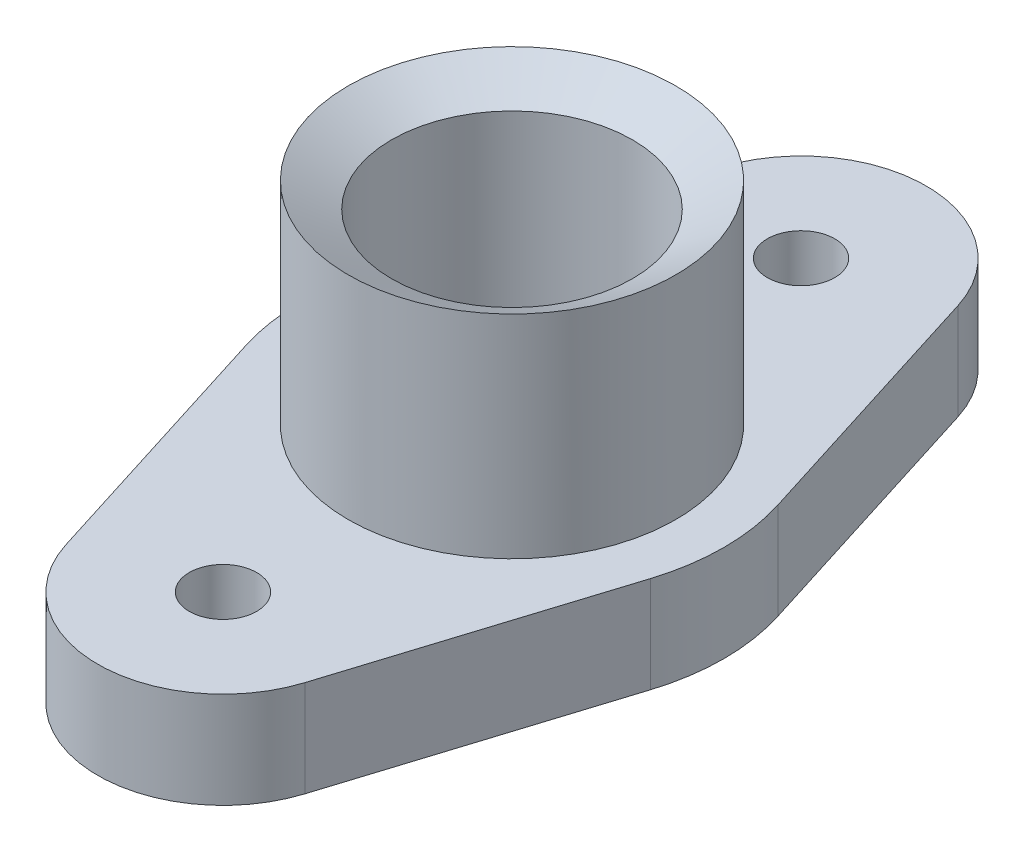
ISO-10303-21;
HEADER;
FILE_DESCRIPTION(('STEP AP214'),'2;1');
FILE_NAME('part.step','',(''),(''),'','','');
FILE_SCHEMA(('AUTOMOTIVE_DESIGN { 1 0 10303 214 1 1 1 1 }'));
ENDSEC;
DATA;
#1=APPLICATION_CONTEXT('core data for automotive mechanical design processes');
#2=APPLICATION_PROTOCOL_DEFINITION('international standard','automotive_design',2000,#1);
#3=PRODUCT_CONTEXT('',#1,'mechanical');
#4=PRODUCT('Part','Part','',(#3));
#5=PRODUCT_RELATED_PRODUCT_CATEGORY('part','',(#4));
#6=PRODUCT_DEFINITION_FORMATION('','',#4);
#7=PRODUCT_DEFINITION_CONTEXT('part definition',#1,'design');
#8=PRODUCT_DEFINITION('design','',#6,#7);
#9=PRODUCT_DEFINITION_SHAPE('','',#8);
#10=(LENGTH_UNIT() NAMED_UNIT(*) SI_UNIT(.MILLI.,.METRE.));
#11=(NAMED_UNIT(*) PLANE_ANGLE_UNIT() SI_UNIT($,.RADIAN.));
#12=(NAMED_UNIT(*) SI_UNIT($,.STERADIAN.) SOLID_ANGLE_UNIT());
#13=UNCERTAINTY_MEASURE_WITH_UNIT(LENGTH_MEASURE(1.E-05),#10,'distance_accuracy_value','');
#14=(GEOMETRIC_REPRESENTATION_CONTEXT(3) GLOBAL_UNCERTAINTY_ASSIGNED_CONTEXT((#13)) GLOBAL_UNIT_ASSIGNED_CONTEXT((#10,
#11,#12)) REPRESENTATION_CONTEXT('',''));
#15=CARTESIAN_POINT('',(0.,0.,0.));
#16=DIRECTION('',(0.,0.,1.));
#17=DIRECTION('',(1.,0.,0.));
#18=AXIS2_PLACEMENT_3D('',#15,#16,#17);
#19=CARTESIAN_POINT('',(0.,32.,0.));
#20=DIRECTION('',(0.,1.,0.));
#21=DIRECTION('',(0.,0.,1.));
#22=AXIS2_PLACEMENT_3D('',#19,#20,#21);
#23=CYLINDRICAL_SURFACE('',#22,12.5);
#24=CARTESIAN_POINT('',(0.,0.,0.));
#25=DIRECTION('',(0.,1.,0.));
#26=DIRECTION('',(0.,0.,1.));
#27=AXIS2_PLACEMENT_3D('',#24,#25,#26);
#28=CIRCLE('',#27,12.5);
#29=CARTESIAN_POINT('',(0.,0.,12.5));
#30=VERTEX_POINT('',#29);
#31=EDGE_CURVE('E232',#30,#30,#28,.T.);
#32=ORIENTED_EDGE('',*,*,#31,.F.);
#33=EDGE_LOOP('',(#32));
#34=FACE_BOUND('',#33,.T.);
#35=CARTESIAN_POINT('',(0.,29.4019237886467,0.));
#36=DIRECTION('',(0.,1.,0.));
#37=DIRECTION('',(-1.,0.,0.));
#38=AXIS2_PLACEMENT_3D('',#35,#36,#37);
#39=CIRCLE('',#38,12.5);
#40=CARTESIAN_POINT('',(-12.5,29.4019237886467,0.));
#41=VERTEX_POINT('',#40);
#42=EDGE_CURVE('E45',#41,#41,#39,.F.);
#43=ORIENTED_EDGE('',*,*,#42,.F.);
#44=EDGE_LOOP('',(#43));
#45=FACE_BOUND('',#44,.T.);
#46=ADVANCED_FACE('F41',(#34,#45),#23,.F.);
#47=CARTESIAN_POINT('',(0.,10.,0.));
#48=DIRECTION('',(0.,-1.,0.));
#49=DIRECTION('',(0.,0.,-1.));
#50=AXIS2_PLACEMENT_3D('',#47,#48,#49);
#51=CYLINDRICAL_SURFACE('',#50,22.);
#52=CARTESIAN_POINT('',(0.,0.,0.));
#53=DIRECTION('',(0.,1.,0.));
#54=DIRECTION('',(0.,0.,1.));
#55=AXIS2_PLACEMENT_3D('',#52,#53,#54);
#56=CIRCLE('',#55,22.);
#57=CARTESIAN_POINT('',(20.9866624311728,0.,6.6));
#58=VERTEX_POINT('',#57);
#59=CARTESIAN_POINT('',(20.9866624311728,0.,-6.6));
#60=VERTEX_POINT('',#59);
#61=EDGE_CURVE('E143',#58,#60,#56,.T.);
#62=ORIENTED_EDGE('',*,*,#61,.T.);
#63=DIRECTION('',(0.,-1.,0.));
#64=VECTOR('',#63,1.);
#65=CARTESIAN_POINT('',(20.9866624311728,10.,-6.6));
#66=LINE('',#65,#64);
#67=CARTESIAN_POINT('',(20.9866624311728,10.,-6.6));
#68=VERTEX_POINT('',#67);
#69=EDGE_CURVE('E52',#68,#60,#66,.T.);
#70=ORIENTED_EDGE('',*,*,#69,.F.);
#71=CARTESIAN_POINT('',(0.,10.,0.));
#72=DIRECTION('',(0.,1.,0.));
#73=DIRECTION('',(0.,0.,1.));
#74=AXIS2_PLACEMENT_3D('',#71,#72,#73);
#75=CIRCLE('',#74,22.);
#76=CARTESIAN_POINT('',(20.9866624311728,10.,6.6));
#77=VERTEX_POINT('',#76);
#78=EDGE_CURVE('E98',#77,#68,#75,.T.);
#79=ORIENTED_EDGE('',*,*,#78,.F.);
#80=DIRECTION('',(0.,-1.,0.));
#81=VECTOR('',#80,1.);
#82=CARTESIAN_POINT('',(20.9866624311728,10.,6.6));
#83=LINE('',#82,#81);
#84=EDGE_CURVE('E139',#77,#58,#83,.T.);
#85=ORIENTED_EDGE('',*,*,#84,.T.);
#86=EDGE_LOOP('',(#62,#70,#79,#85));
#87=FACE_BOUND('',#86,.T.);
#88=ADVANCED_FACE('F43',(#87),#51,.T.);
#89=CARTESIAN_POINT('',(20.9866624311728,10.,-6.59999999999999));
#90=DIRECTION('',(0.953939201416946,0.,-0.3));
#91=DIRECTION('',(-0.3,0.,-0.953939201416946));
#92=AXIS2_PLACEMENT_3D('',#89,#90,#91);
#93=PLANE('',#92);
#94=DIRECTION('',(0.3,0.,0.953939201416946));
#95=VECTOR('',#94,1.);
#96=CARTESIAN_POINT('',(20.9866624311728,0.,-6.59999999999999));
#97=LINE('',#96,#95);
#98=CARTESIAN_POINT('',(12.4012096184203,0.,-33.9));
#99=VERTEX_POINT('',#98);
#100=EDGE_CURVE('E147',#99,#60,#97,.T.);
#101=ORIENTED_EDGE('',*,*,#100,.F.);
#102=DIRECTION('',(0.,-1.,0.));
#103=VECTOR('',#102,1.);
#104=CARTESIAN_POINT('',(12.4012096184203,10.,-33.9));
#105=LINE('',#104,#103);
#106=CARTESIAN_POINT('',(12.4012096184203,10.,-33.9));
#107=VERTEX_POINT('',#106);
#108=EDGE_CURVE('E183',#107,#99,#105,.T.);
#109=ORIENTED_EDGE('',*,*,#108,.F.);
#110=DIRECTION('',(0.3,0.,0.953939201416946));
#111=VECTOR('',#110,1.);
#112=CARTESIAN_POINT('',(20.9866624311728,10.,-6.59999999999999));
#113=LINE('',#112,#111);
#114=EDGE_CURVE('E190',#107,#68,#113,.T.);
#115=ORIENTED_EDGE('',*,*,#114,.T.);
#116=ORIENTED_EDGE('',*,*,#69,.T.);
#117=EDGE_LOOP('',(#101,#109,#115,#116));
#118=FACE_BOUND('',#117,.T.);
#119=ADVANCED_FACE('F189',(#118),#93,.T.);
#120=CARTESIAN_POINT('',(0.,10.,-30.));
#121=DIRECTION('',(0.,-1.,0.));
#122=DIRECTION('',(0.,0.,-1.));
#123=AXIS2_PLACEMENT_3D('',#120,#121,#122);
#124=CYLINDRICAL_SURFACE('',#123,13.);
#125=CARTESIAN_POINT('',(0.,0.,-30.));
#126=DIRECTION('',(0.,1.,0.));
#127=DIRECTION('',(0.,0.,1.));
#128=AXIS2_PLACEMENT_3D('',#125,#126,#127);
#129=CIRCLE('',#128,13.);
#130=CARTESIAN_POINT('',(-12.4012096184203,0.,-33.9));
#131=VERTEX_POINT('',#130);
#132=EDGE_CURVE('E152',#99,#131,#129,.T.);
#133=ORIENTED_EDGE('',*,*,#132,.T.);
#134=DIRECTION('',(0.,-1.,0.));
#135=VECTOR('',#134,1.);
#136=CARTESIAN_POINT('',(-12.4012096184203,10.,-33.9));
#137=LINE('',#136,#135);
#138=CARTESIAN_POINT('',(-12.4012096184203,10.,-33.9));
#139=VERTEX_POINT('',#138);
#140=EDGE_CURVE('E179',#139,#131,#137,.T.);
#141=ORIENTED_EDGE('',*,*,#140,.F.);
#142=CARTESIAN_POINT('',(0.,10.,-30.));
#143=DIRECTION('',(0.,1.,0.));
#144=DIRECTION('',(0.,0.,1.));
#145=AXIS2_PLACEMENT_3D('',#142,#143,#144);
#146=CIRCLE('',#145,13.);
#147=EDGE_CURVE('E207',#107,#139,#146,.T.);
#148=ORIENTED_EDGE('',*,*,#147,.F.);
#149=ORIENTED_EDGE('',*,*,#108,.T.);
#150=EDGE_LOOP('',(#133,#141,#148,#149));
#151=FACE_BOUND('',#150,.T.);
#152=ADVANCED_FACE('F199',(#151),#124,.T.);
#153=CARTESIAN_POINT('',(-20.9866624311728,10.,-6.59999999999999));
#154=DIRECTION('',(0.953939201416946,0.,0.3));
#155=DIRECTION('',(0.3,0.,-0.953939201416946));
#156=AXIS2_PLACEMENT_3D('',#153,#154,#155);
#157=PLANE('',#156);
#158=DIRECTION('',(-0.3,0.,0.953939201416946));
#159=VECTOR('',#158,1.);
#160=CARTESIAN_POINT('',(-20.9866624311728,0.,-6.59999999999999));
#161=LINE('',#160,#159);
#162=CARTESIAN_POINT('',(-20.9866624311728,0.,-6.6));
#163=VERTEX_POINT('',#162);
#164=EDGE_CURVE('E155',#131,#163,#161,.T.);
#165=ORIENTED_EDGE('',*,*,#164,.T.);
#166=DIRECTION('',(0.,-1.,0.));
#167=VECTOR('',#166,1.);
#168=CARTESIAN_POINT('',(-20.9866624311728,10.,-6.6));
#169=LINE('',#168,#167);
#170=CARTESIAN_POINT('',(-20.9866624311728,10.,-6.6));
#171=VERTEX_POINT('',#170);
#172=EDGE_CURVE('E176',#171,#163,#169,.T.);
#173=ORIENTED_EDGE('',*,*,#172,.F.);
#174=DIRECTION('',(-0.3,0.,0.953939201416946));
#175=VECTOR('',#174,1.);
#176=CARTESIAN_POINT('',(-20.9866624311728,10.,-6.59999999999999));
#177=LINE('',#176,#175);
#178=EDGE_CURVE('E205',#139,#171,#177,.T.);
#179=ORIENTED_EDGE('',*,*,#178,.F.);
#180=ORIENTED_EDGE('',*,*,#140,.T.);
#181=EDGE_LOOP('',(#165,#173,#179,#180));
#182=FACE_BOUND('',#181,.T.);
#183=ADVANCED_FACE('F203',(#182),#157,.F.);
#184=CARTESIAN_POINT('',(0.,10.,0.));
#185=DIRECTION('',(0.,-1.,0.));
#186=DIRECTION('',(0.,0.,-1.));
#187=AXIS2_PLACEMENT_3D('',#184,#185,#186);
#188=CYLINDRICAL_SURFACE('',#187,22.);
#189=CARTESIAN_POINT('',(0.,0.,0.));
#190=DIRECTION('',(0.,1.,0.));
#191=DIRECTION('',(0.,0.,1.));
#192=AXIS2_PLACEMENT_3D('',#189,#190,#191);
#193=CIRCLE('',#192,22.);
#194=CARTESIAN_POINT('',(-20.9866624311728,0.,6.6));
#195=VERTEX_POINT('',#194);
#196=EDGE_CURVE('E159',#195,#163,#193,.F.);
#197=ORIENTED_EDGE('',*,*,#196,.F.);
#198=DIRECTION('',(0.,-1.,0.));
#199=VECTOR('',#198,1.);
#200=CARTESIAN_POINT('',(-20.9866624311728,10.,6.6));
#201=LINE('',#200,#199);
#202=CARTESIAN_POINT('',(-20.9866624311728,10.,6.6));
#203=VERTEX_POINT('',#202);
#204=EDGE_CURVE('E126',#203,#195,#201,.T.);
#205=ORIENTED_EDGE('',*,*,#204,.F.);
#206=CARTESIAN_POINT('',(0.,10.,0.));
#207=DIRECTION('',(0.,1.,0.));
#208=DIRECTION('',(0.,0.,1.));
#209=AXIS2_PLACEMENT_3D('',#206,#207,#208);
#210=CIRCLE('',#209,22.);
#211=EDGE_CURVE('E132',#203,#171,#210,.F.);
#212=ORIENTED_EDGE('',*,*,#211,.T.);
#213=ORIENTED_EDGE('',*,*,#172,.T.);
#214=EDGE_LOOP('',(#197,#205,#212,#213));
#215=FACE_BOUND('',#214,.T.);
#216=ADVANCED_FACE('F281',(#215),#188,.T.);
#217=CARTESIAN_POINT('',(-20.9866624311728,10.,6.59999999999999));
#218=DIRECTION('',(-0.953939201416946,0.,0.3));
#219=DIRECTION('',(0.3,0.,0.953939201416946));
#220=AXIS2_PLACEMENT_3D('',#217,#218,#219);
#221=PLANE('',#220);
#222=DIRECTION('',(-0.3,0.,-0.953939201416946));
#223=VECTOR('',#222,1.);
#224=CARTESIAN_POINT('',(-20.9866624311728,0.,6.59999999999999));
#225=LINE('',#224,#223);
#226=CARTESIAN_POINT('',(-12.4012096184203,0.,33.9));
#227=VERTEX_POINT('',#226);
#228=EDGE_CURVE('E120',#227,#195,#225,.T.);
#229=ORIENTED_EDGE('',*,*,#228,.F.);
#230=DIRECTION('',(0.,-1.,0.));
#231=VECTOR('',#230,1.);
#232=CARTESIAN_POINT('',(-12.4012096184203,10.,33.9));
#233=LINE('',#232,#231);
#234=CARTESIAN_POINT('',(-12.4012096184203,10.,33.9));
#235=VERTEX_POINT('',#234);
#236=EDGE_CURVE('E115',#235,#227,#233,.T.);
#237=ORIENTED_EDGE('',*,*,#236,.F.);
#238=DIRECTION('',(-0.3,0.,-0.953939201416946));
#239=VECTOR('',#238,1.);
#240=CARTESIAN_POINT('',(-20.9866624311728,10.,6.59999999999999));
#241=LINE('',#240,#239);
#242=EDGE_CURVE('E118',#235,#203,#241,.T.);
#243=ORIENTED_EDGE('',*,*,#242,.T.);
#244=ORIENTED_EDGE('',*,*,#204,.T.);
#245=EDGE_LOOP('',(#229,#237,#243,#244));
#246=FACE_BOUND('',#245,.T.);
#247=ADVANCED_FACE('F117',(#246),#221,.T.);
#248=CARTESIAN_POINT('',(0.,10.,30.));
#249=DIRECTION('',(0.,-1.,0.));
#250=DIRECTION('',(0.,0.,-1.));
#251=AXIS2_PLACEMENT_3D('',#248,#249,#250);
#252=CYLINDRICAL_SURFACE('',#251,13.);
#253=CARTESIAN_POINT('',(0.,0.,30.));
#254=DIRECTION('',(0.,1.,0.));
#255=DIRECTION('',(0.,0.,1.));
#256=AXIS2_PLACEMENT_3D('',#253,#254,#255);
#257=CIRCLE('',#256,13.);
#258=CARTESIAN_POINT('',(12.4012096184203,0.,33.9));
#259=VERTEX_POINT('',#258);
#260=EDGE_CURVE('E165',#259,#227,#257,.F.);
#261=ORIENTED_EDGE('',*,*,#260,.F.);
#262=DIRECTION('',(0.,-1.,0.));
#263=VECTOR('',#262,1.);
#264=CARTESIAN_POINT('',(12.4012096184203,10.,33.9));
#265=LINE('',#264,#263);
#266=CARTESIAN_POINT('',(12.4012096184203,10.,33.9));
#267=VERTEX_POINT('',#266);
#268=EDGE_CURVE('E89',#267,#259,#265,.T.);
#269=ORIENTED_EDGE('',*,*,#268,.F.);
#270=CARTESIAN_POINT('',(0.,10.,30.));
#271=DIRECTION('',(0.,1.,0.));
#272=DIRECTION('',(0.,0.,1.));
#273=AXIS2_PLACEMENT_3D('',#270,#271,#272);
#274=CIRCLE('',#273,13.);
#275=EDGE_CURVE('E130',#267,#235,#274,.F.);
#276=ORIENTED_EDGE('',*,*,#275,.T.);
#277=ORIENTED_EDGE('',*,*,#236,.T.);
#278=EDGE_LOOP('',(#261,#269,#276,#277));
#279=FACE_BOUND('',#278,.T.);
#280=ADVANCED_FACE('F135',(#279),#252,.T.);
#281=CARTESIAN_POINT('',(20.9866624311728,10.,6.59999999999999));
#282=DIRECTION('',(-0.953939201416946,0.,-0.3));
#283=DIRECTION('',(-0.3,0.,0.953939201416946));
#284=AXIS2_PLACEMENT_3D('',#281,#282,#283);
#285=PLANE('',#284);
#286=DIRECTION('',(0.3,0.,-0.953939201416946));
#287=VECTOR('',#286,1.);
#288=CARTESIAN_POINT('',(20.9866624311728,0.,6.59999999999999));
#289=LINE('',#288,#287);
#290=EDGE_CURVE('E92',#259,#58,#289,.T.);
#291=ORIENTED_EDGE('',*,*,#290,.T.);
#292=ORIENTED_EDGE('',*,*,#84,.F.);
#293=DIRECTION('',(0.3,0.,-0.953939201416946));
#294=VECTOR('',#293,1.);
#295=CARTESIAN_POINT('',(20.9866624311728,10.,6.59999999999999));
#296=LINE('',#295,#294);
#297=EDGE_CURVE('E61',#267,#77,#296,.T.);
#298=ORIENTED_EDGE('',*,*,#297,.F.);
#299=ORIENTED_EDGE('',*,*,#268,.T.);
#300=EDGE_LOOP('',(#291,#292,#298,#299));
#301=FACE_BOUND('',#300,.T.);
#302=ADVANCED_FACE('F270',(#301),#285,.F.);
#303=CARTESIAN_POINT('',(0.,10.,0.));
#304=DIRECTION('',(0.,1.,0.));
#305=DIRECTION('',(0.,0.,1.));
#306=AXIS2_PLACEMENT_3D('',#303,#304,#305);
#307=PLANE('',#306);
#308=CARTESIAN_POINT('',(0.,10.,-30.));
#309=DIRECTION('',(0.,1.,0.));
#310=DIRECTION('',(0.,0.,1.));
#311=AXIS2_PLACEMENT_3D('',#308,#309,#310);
#312=CIRCLE('',#311,3.49999999999999);
#313=CARTESIAN_POINT('',(0.,10.,-26.5));
#314=VERTEX_POINT('',#313);
#315=EDGE_CURVE('E228',#314,#314,#312,.T.);
#316=ORIENTED_EDGE('',*,*,#315,.F.);
#317=EDGE_LOOP('',(#316));
#318=FACE_BOUND('',#317,.T.);
#319=CARTESIAN_POINT('',(0.,10.,30.));
#320=DIRECTION('',(0.,1.,0.));
#321=DIRECTION('',(0.,0.,1.));
#322=AXIS2_PLACEMENT_3D('',#319,#320,#321);
#323=CIRCLE('',#322,3.49999999999999);
#324=CARTESIAN_POINT('',(0.,10.,33.5));
#325=VERTEX_POINT('',#324);
#326=EDGE_CURVE('E220',#325,#325,#323,.T.);
#327=ORIENTED_EDGE('',*,*,#326,.F.);
#328=EDGE_LOOP('',(#327));
#329=FACE_BOUND('',#328,.T.);
#330=CARTESIAN_POINT('',(0.,10.,0.));
#331=DIRECTION('',(0.,1.,0.));
#332=DIRECTION('',(0.,0.,1.));
#333=AXIS2_PLACEMENT_3D('',#330,#331,#332);
#334=CIRCLE('',#333,17.);
#335=CARTESIAN_POINT('',(0.,10.,17.));
#336=VERTEX_POINT('',#335);
#337=EDGE_CURVE('E11',#336,#336,#334,.T.);
#338=ORIENTED_EDGE('',*,*,#337,.F.);
#339=EDGE_LOOP('',(#338));
#340=FACE_BOUND('',#339,.T.);
#341=ORIENTED_EDGE('',*,*,#78,.T.);
#342=ORIENTED_EDGE('',*,*,#114,.F.);
#343=ORIENTED_EDGE('',*,*,#147,.T.);
#344=ORIENTED_EDGE('',*,*,#178,.T.);
#345=ORIENTED_EDGE('',*,*,#211,.F.);
#346=ORIENTED_EDGE('',*,*,#242,.F.);
#347=ORIENTED_EDGE('',*,*,#275,.F.);
#348=ORIENTED_EDGE('',*,*,#297,.T.);
#349=EDGE_LOOP('',(#341,#342,#343,#344,#345,#346,#347,#348));
#350=FACE_BOUND('',#349,.T.);
#351=ADVANCED_FACE('F129',(#318,#329,#340,#350),#307,.T.);
#352=CARTESIAN_POINT('',(0.,0.,0.));
#353=DIRECTION('',(0.,1.,0.));
#354=DIRECTION('',(0.,0.,1.));
#355=AXIS2_PLACEMENT_3D('',#352,#353,#354);
#356=PLANE('',#355);
#357=ORIENTED_EDGE('',*,*,#31,.T.);
#358=EDGE_LOOP('',(#357));
#359=FACE_BOUND('',#358,.T.);
#360=CARTESIAN_POINT('',(0.,0.,-30.));
#361=DIRECTION('',(0.,1.,0.));
#362=DIRECTION('',(0.,0.,1.));
#363=AXIS2_PLACEMENT_3D('',#360,#361,#362);
#364=CIRCLE('',#363,3.5);
#365=CARTESIAN_POINT('',(0.,0.,-26.5));
#366=VERTEX_POINT('',#365);
#367=EDGE_CURVE('E224',#366,#366,#364,.T.);
#368=ORIENTED_EDGE('',*,*,#367,.T.);
#369=EDGE_LOOP('',(#368));
#370=FACE_BOUND('',#369,.T.);
#371=CARTESIAN_POINT('',(0.,0.,30.));
#372=DIRECTION('',(0.,1.,0.));
#373=DIRECTION('',(0.,0.,1.));
#374=AXIS2_PLACEMENT_3D('',#371,#372,#373);
#375=CIRCLE('',#374,3.5);
#376=CARTESIAN_POINT('',(0.,0.,33.5));
#377=VERTEX_POINT('',#376);
#378=EDGE_CURVE('E148',#377,#377,#375,.T.);
#379=ORIENTED_EDGE('',*,*,#378,.T.);
#380=EDGE_LOOP('',(#379));
#381=FACE_BOUND('',#380,.T.);
#382=ORIENTED_EDGE('',*,*,#61,.F.);
#383=ORIENTED_EDGE('',*,*,#290,.F.);
#384=ORIENTED_EDGE('',*,*,#260,.T.);
#385=ORIENTED_EDGE('',*,*,#228,.T.);
#386=ORIENTED_EDGE('',*,*,#196,.T.);
#387=ORIENTED_EDGE('',*,*,#164,.F.);
#388=ORIENTED_EDGE('',*,*,#132,.F.);
#389=ORIENTED_EDGE('',*,*,#100,.T.);
#390=EDGE_LOOP('',(#382,#383,#384,#385,#386,#387,#388,#389));
#391=FACE_BOUND('',#390,.T.);
#392=ADVANCED_FACE('F195',(#359,#370,#381,#391),#356,.F.);
#393=CARTESIAN_POINT('',(0.,32.,0.));
#394=DIRECTION('',(0.,-1.,0.));
#395=DIRECTION('',(0.,0.,-1.));
#396=AXIS2_PLACEMENT_3D('',#393,#394,#395);
#397=CYLINDRICAL_SURFACE('',#396,17.);
#398=CARTESIAN_POINT('',(0.,32.,0.));
#399=DIRECTION('',(0.,1.,0.));
#400=DIRECTION('',(-1.,0.,0.));
#401=AXIS2_PLACEMENT_3D('',#398,#399,#400);
#402=CIRCLE('',#401,17.);
#403=CARTESIAN_POINT('',(-17.,32.,0.));
#404=VERTEX_POINT('',#403);
#405=EDGE_CURVE('E236',#404,#404,#402,.T.);
#406=ORIENTED_EDGE('',*,*,#405,.F.);
#407=EDGE_LOOP('',(#406));
#408=FACE_BOUND('',#407,.T.);
#409=ORIENTED_EDGE('',*,*,#337,.T.);
#410=EDGE_LOOP('',(#409));
#411=FACE_BOUND('',#410,.T.);
#412=ADVANCED_FACE('F263',(#408,#411),#397,.T.);
#413=CARTESIAN_POINT('',(0.,10.,30.));
#414=DIRECTION('',(0.,1.,0.));
#415=DIRECTION('',(0.,0.,1.));
#416=AXIS2_PLACEMENT_3D('',#413,#414,#415);
#417=CYLINDRICAL_SURFACE('',#416,3.49999999999999);
#418=ORIENTED_EDGE('',*,*,#378,.F.);
#419=EDGE_LOOP('',(#418));
#420=FACE_BOUND('',#419,.T.);
#421=ORIENTED_EDGE('',*,*,#326,.T.);
#422=EDGE_LOOP('',(#421));
#423=FACE_BOUND('',#422,.T.);
#424=ADVANCED_FACE('F259',(#420,#423),#417,.F.);
#425=CARTESIAN_POINT('',(0.,10.,-30.));
#426=DIRECTION('',(0.,1.,0.));
#427=DIRECTION('',(0.,0.,1.));
#428=AXIS2_PLACEMENT_3D('',#425,#426,#427);
#429=CYLINDRICAL_SURFACE('',#428,3.49999999999999);
#430=ORIENTED_EDGE('',*,*,#367,.F.);
#431=EDGE_LOOP('',(#430));
#432=FACE_BOUND('',#431,.T.);
#433=ORIENTED_EDGE('',*,*,#315,.T.);
#434=EDGE_LOOP('',(#433));
#435=FACE_BOUND('',#434,.T.);
#436=ADVANCED_FACE('F256',(#432,#435),#429,.F.);
#437=CARTESIAN_POINT('',(0.,22.1850454237762,0.));
#438=DIRECTION('',(0.,1.,0.));
#439=DIRECTION('',(-1.,0.,0.));
#440=AXIS2_PLACEMENT_3D('',#437,#438,#439);
#441=CONICAL_SURFACE('',#440,0.,1.04719755119659);
#442=ORIENTED_EDGE('',*,*,#405,.T.);
#443=EDGE_LOOP('',(#442));
#444=FACE_BOUND('',#443,.T.);
#445=ORIENTED_EDGE('',*,*,#42,.T.);
#446=EDGE_LOOP('',(#445));
#447=FACE_BOUND('',#446,.T.);
#448=ADVANCED_FACE('F245',(#444,#447),#441,.F.);
#449=CLOSED_SHELL('',(#46,#88,#119,#152,#183,#216,#247,#280,#302,#351,#392,#412,#424,#436,#448));
#450=MANIFOLD_SOLID_BREP('B2',#449);
#451=ADVANCED_BREP_SHAPE_REPRESENTATION('',(#18,#450),#14);
#452=SHAPE_DEFINITION_REPRESENTATION(#9,#451);
ENDSEC;
END-ISO-10303-21;
